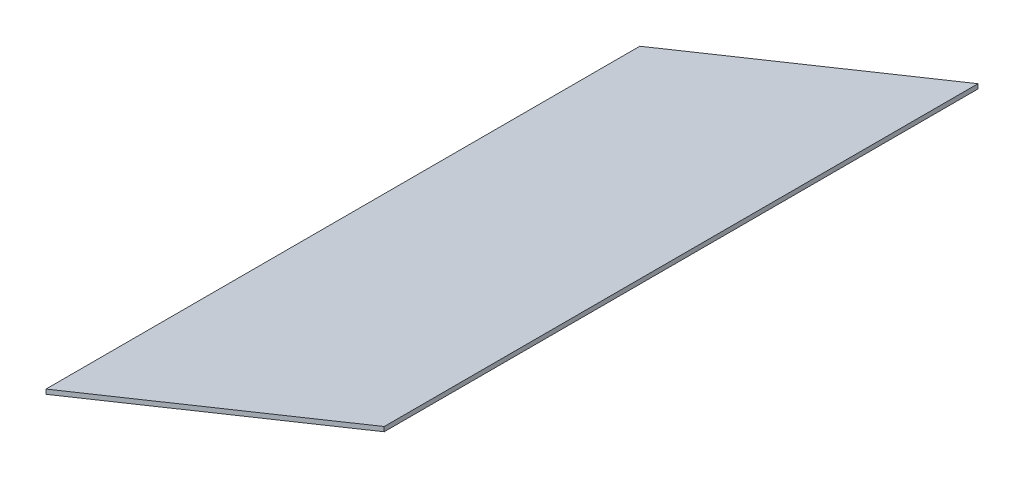
ISO-10303-21;
HEADER;
FILE_DESCRIPTION(('STEP AP214'),'2;1');
FILE_NAME('part.step','',(''),(''),'','','');
FILE_SCHEMA(('AUTOMOTIVE_DESIGN { 1 0 10303 214 1 1 1 1 }'));
ENDSEC;
DATA;
#1=APPLICATION_CONTEXT('core data for automotive mechanical design processes');
#2=APPLICATION_PROTOCOL_DEFINITION('international standard','automotive_design',2000,#1);
#3=PRODUCT_CONTEXT('',#1,'mechanical');
#4=PRODUCT('Part','Part','',(#3));
#5=PRODUCT_RELATED_PRODUCT_CATEGORY('part','',(#4));
#6=PRODUCT_DEFINITION_FORMATION('','',#4);
#7=PRODUCT_DEFINITION_CONTEXT('part definition',#1,'design');
#8=PRODUCT_DEFINITION('design','',#6,#7);
#9=PRODUCT_DEFINITION_SHAPE('','',#8);
#10=(LENGTH_UNIT() NAMED_UNIT(*) SI_UNIT(.MILLI.,.METRE.));
#11=(NAMED_UNIT(*) PLANE_ANGLE_UNIT() SI_UNIT($,.RADIAN.));
#12=(NAMED_UNIT(*) SI_UNIT($,.STERADIAN.) SOLID_ANGLE_UNIT());
#13=UNCERTAINTY_MEASURE_WITH_UNIT(LENGTH_MEASURE(1.E-05),#10,'distance_accuracy_value','');
#14=(GEOMETRIC_REPRESENTATION_CONTEXT(3) GLOBAL_UNCERTAINTY_ASSIGNED_CONTEXT((#13)) GLOBAL_UNIT_ASSIGNED_CONTEXT((#10,
#11,#12)) REPRESENTATION_CONTEXT('',''));
#15=CARTESIAN_POINT('',(0.,0.,0.));
#16=DIRECTION('',(0.,0.,1.));
#17=DIRECTION('',(1.,0.,0.));
#18=AXIS2_PLACEMENT_3D('',#15,#16,#17);
#19=CARTESIAN_POINT('',(0.,0.,-350.));
#20=DIRECTION('',(-0.374606593415913,0.927183854566787,0.));
#21=DIRECTION('',(-0.927183854566787,-0.374606593415913,0.));
#22=AXIS2_PLACEMENT_3D('',#19,#20,#21);
#23=PLANE('',#22);
#24=DIRECTION('',(0.,0.,1.));
#25=VECTOR('',#24,1.);
#26=CARTESIAN_POINT('',(0.,0.,-350.));
#27=LINE('',#26,#25);
#28=CARTESIAN_POINT('',(0.,0.,-350.));
#29=VERTEX_POINT('',#28);
#30=CARTESIAN_POINT('',(0.,0.,350.));
#31=VERTEX_POINT('',#30);
#32=EDGE_CURVE('E11',#29,#31,#27,.T.);
#33=ORIENTED_EDGE('',*,*,#32,.T.);
#34=DIRECTION('',(-0.927183854566787,-0.374606593415913,0.));
#35=VECTOR('',#34,1.);
#36=CARTESIAN_POINT('',(0.,0.,350.));
#37=LINE('',#36,#35);
#38=CARTESIAN_POINT('',(398.689057463718,161.080835168843,350.));
#39=VERTEX_POINT('',#38);
#40=EDGE_CURVE('E89',#39,#31,#37,.T.);
#41=ORIENTED_EDGE('',*,*,#40,.F.);
#42=DIRECTION('',(0.,0.,1.));
#43=VECTOR('',#42,1.);
#44=CARTESIAN_POINT('',(398.689057463718,161.080835168843,-350.));
#45=LINE('',#44,#43);
#46=CARTESIAN_POINT('',(398.689057463718,161.080835168843,-350.));
#47=VERTEX_POINT('',#46);
#48=EDGE_CURVE('E44',#47,#39,#45,.T.);
#49=ORIENTED_EDGE('',*,*,#48,.F.);
#50=DIRECTION('',(-0.927183854566787,-0.374606593415913,0.));
#51=VECTOR('',#50,1.);
#52=CARTESIAN_POINT('',(0.,0.,-350.));
#53=LINE('',#52,#51);
#54=EDGE_CURVE('E81',#47,#29,#53,.T.);
#55=ORIENTED_EDGE('',*,*,#54,.T.);
#56=EDGE_LOOP('',(#33,#41,#49,#55));
#57=FACE_BOUND('',#56,.T.);
#58=ADVANCED_FACE('F35',(#57),#23,.T.);
#59=CARTESIAN_POINT('',(398.689057463718,161.080835168843,-350.));
#60=DIRECTION('',(1.,0.,0.));
#61=DIRECTION('',(0.,0.,-1.));
#62=AXIS2_PLACEMENT_3D('',#59,#60,#61);
#63=PLANE('',#62);
#64=ORIENTED_EDGE('',*,*,#48,.T.);
#65=DIRECTION('',(0.,1.,0.));
#66=VECTOR('',#65,1.);
#67=CARTESIAN_POINT('',(398.689057463718,161.080835168843,350.));
#68=LINE('',#67,#66);
#69=CARTESIAN_POINT('',(398.689057463718,155.688161455455,350.));
#70=VERTEX_POINT('',#69);
#71=EDGE_CURVE('E93',#70,#39,#68,.T.);
#72=ORIENTED_EDGE('',*,*,#71,.F.);
#73=DIRECTION('',(0.,0.,1.));
#74=VECTOR('',#73,1.);
#75=CARTESIAN_POINT('',(398.689057463718,155.688161455455,-350.));
#76=LINE('',#75,#74);
#77=CARTESIAN_POINT('',(398.689057463718,155.688161455455,-350.));
#78=VERTEX_POINT('',#77);
#79=EDGE_CURVE('E80',#78,#70,#76,.T.);
#80=ORIENTED_EDGE('',*,*,#79,.F.);
#81=DIRECTION('',(0.,1.,0.));
#82=VECTOR('',#81,1.);
#83=CARTESIAN_POINT('',(398.689057463718,161.080835168843,-350.));
#84=LINE('',#83,#82);
#85=EDGE_CURVE('E101',#78,#47,#84,.T.);
#86=ORIENTED_EDGE('',*,*,#85,.T.);
#87=EDGE_LOOP('',(#64,#72,#80,#86));
#88=FACE_BOUND('',#87,.T.);
#89=ADVANCED_FACE('F105',(#88),#63,.T.);
#90=CARTESIAN_POINT('',(1.87303296707957,-4.63591927283393,-350.));
#91=DIRECTION('',(0.374606593415913,-0.927183854566787,0.));
#92=DIRECTION('',(0.927183854566787,0.374606593415913,0.));
#93=AXIS2_PLACEMENT_3D('',#90,#91,#92);
#94=PLANE('',#93);
#95=ORIENTED_EDGE('',*,*,#79,.T.);
#96=DIRECTION('',(0.927183854566787,0.374606593415913,0.));
#97=VECTOR('',#96,1.);
#98=CARTESIAN_POINT('',(1.87303296707957,-4.63591927283393,350.));
#99=LINE('',#98,#97);
#100=CARTESIAN_POINT('',(0.,-5.39267371338792,350.));
#101=VERTEX_POINT('',#100);
#102=EDGE_CURVE('E87',#101,#70,#99,.T.);
#103=ORIENTED_EDGE('',*,*,#102,.F.);
#104=DIRECTION('',(0.,0.,1.));
#105=VECTOR('',#104,1.);
#106=CARTESIAN_POINT('',(0.,-5.39267371338792,-350.));
#107=LINE('',#106,#105);
#108=CARTESIAN_POINT('',(0.,-5.39267371338792,-350.));
#109=VERTEX_POINT('',#108);
#110=EDGE_CURVE('E39',#109,#101,#107,.T.);
#111=ORIENTED_EDGE('',*,*,#110,.F.);
#112=DIRECTION('',(0.927183854566787,0.374606593415913,0.));
#113=VECTOR('',#112,1.);
#114=CARTESIAN_POINT('',(1.87303296707957,-4.63591927283393,-350.));
#115=LINE('',#114,#113);
#116=EDGE_CURVE('E99',#109,#78,#115,.T.);
#117=ORIENTED_EDGE('',*,*,#116,.T.);
#118=EDGE_LOOP('',(#95,#103,#111,#117));
#119=FACE_BOUND('',#118,.T.);
#120=ADVANCED_FACE('F91',(#119),#94,.T.);
#121=CARTESIAN_POINT('',(0.,-5.,-350.));
#122=DIRECTION('',(-1.,0.,0.));
#123=DIRECTION('',(0.,-1.,0.));
#124=AXIS2_PLACEMENT_3D('',#121,#122,#123);
#125=PLANE('',#124);
#126=ORIENTED_EDGE('',*,*,#110,.T.);
#127=DIRECTION('',(0.,-1.,0.));
#128=VECTOR('',#127,1.);
#129=CARTESIAN_POINT('',(0.,0.,350.));
#130=LINE('',#129,#128);
#131=EDGE_CURVE('E75',#31,#101,#130,.T.);
#132=ORIENTED_EDGE('',*,*,#131,.F.);
#133=ORIENTED_EDGE('',*,*,#32,.F.);
#134=DIRECTION('',(0.,-1.,0.));
#135=VECTOR('',#134,1.);
#136=CARTESIAN_POINT('',(0.,0.,-350.));
#137=LINE('',#136,#135);
#138=EDGE_CURVE('E76',#29,#109,#137,.T.);
#139=ORIENTED_EDGE('',*,*,#138,.T.);
#140=EDGE_LOOP('',(#126,#132,#133,#139));
#141=FACE_BOUND('',#140,.T.);
#142=ADVANCED_FACE('F37',(#141),#125,.T.);
#143=CARTESIAN_POINT('',(0.,0.,-350.));
#144=DIRECTION('',(0.,0.,-1.));
#145=DIRECTION('',(-1.,0.,0.));
#146=AXIS2_PLACEMENT_3D('',#143,#144,#145);
#147=PLANE('',#146);
#148=ORIENTED_EDGE('',*,*,#138,.F.);
#149=ORIENTED_EDGE('',*,*,#54,.F.);
#150=ORIENTED_EDGE('',*,*,#85,.F.);
#151=ORIENTED_EDGE('',*,*,#116,.F.);
#152=EDGE_LOOP('',(#148,#149,#150,#151));
#153=FACE_BOUND('',#152,.T.);
#154=ADVANCED_FACE('F109',(#153),#147,.T.);
#155=CARTESIAN_POINT('',(0.,0.,350.));
#156=DIRECTION('',(0.,0.,-1.));
#157=DIRECTION('',(-1.,0.,0.));
#158=AXIS2_PLACEMENT_3D('',#155,#156,#157);
#159=PLANE('',#158);
#160=ORIENTED_EDGE('',*,*,#131,.T.);
#161=ORIENTED_EDGE('',*,*,#102,.T.);
#162=ORIENTED_EDGE('',*,*,#71,.T.);
#163=ORIENTED_EDGE('',*,*,#40,.T.);
#164=EDGE_LOOP('',(#160,#161,#162,#163));
#165=FACE_BOUND('',#164,.T.);
#166=ADVANCED_FACE('F85',(#165),#159,.F.);
#167=CLOSED_SHELL('',(#58,#89,#120,#142,#154,#166));
#168=MANIFOLD_SOLID_BREP('B2',#167);
#169=ADVANCED_BREP_SHAPE_REPRESENTATION('',(#18,#168),#14);
#170=SHAPE_DEFINITION_REPRESENTATION(#9,#169);
ENDSEC;
END-ISO-10303-21;
